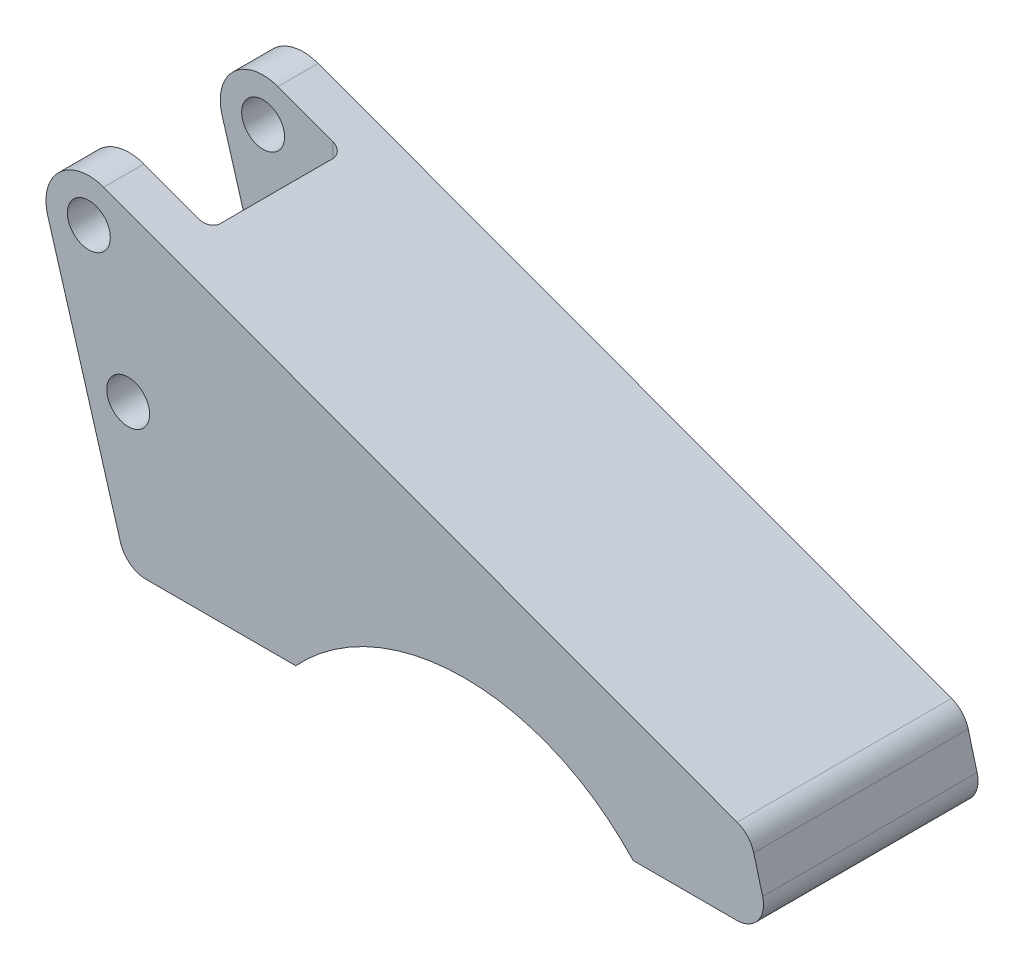
ISO-10303-21;
HEADER;
FILE_DESCRIPTION(('STEP AP214'),'2;1');
FILE_NAME('part.step','',(''),(''),'','','');
FILE_SCHEMA(('AUTOMOTIVE_DESIGN { 1 0 10303 214 1 1 1 1 }'));
ENDSEC;
DATA;
#1=APPLICATION_CONTEXT('core data for automotive mechanical design processes');
#2=APPLICATION_PROTOCOL_DEFINITION('international standard','automotive_design',2000,#1);
#3=PRODUCT_CONTEXT('',#1,'mechanical');
#4=PRODUCT('Part','Part','',(#3));
#5=PRODUCT_RELATED_PRODUCT_CATEGORY('part','',(#4));
#6=PRODUCT_DEFINITION_FORMATION('','',#4);
#7=PRODUCT_DEFINITION_CONTEXT('part definition',#1,'design');
#8=PRODUCT_DEFINITION('design','',#6,#7);
#9=PRODUCT_DEFINITION_SHAPE('','',#8);
#10=(LENGTH_UNIT() NAMED_UNIT(*) SI_UNIT(.MILLI.,.METRE.));
#11=(NAMED_UNIT(*) PLANE_ANGLE_UNIT() SI_UNIT($,.RADIAN.));
#12=(NAMED_UNIT(*) SI_UNIT($,.STERADIAN.) SOLID_ANGLE_UNIT());
#13=UNCERTAINTY_MEASURE_WITH_UNIT(LENGTH_MEASURE(1.E-05),#10,'distance_accuracy_value','');
#14=(GEOMETRIC_REPRESENTATION_CONTEXT(3) GLOBAL_UNCERTAINTY_ASSIGNED_CONTEXT((#13)) GLOBAL_UNIT_ASSIGNED_CONTEXT((#10,
#11,#12)) REPRESENTATION_CONTEXT('',''));
#15=CARTESIAN_POINT('',(0.,0.,0.));
#16=DIRECTION('',(0.,0.,1.));
#17=DIRECTION('',(1.,0.,0.));
#18=AXIS2_PLACEMENT_3D('',#15,#16,#17);
#19=CARTESIAN_POINT('',(6.94754617431199,-51.87,-40.));
#20=DIRECTION('',(-0.959205668272246,-0.282709189723987,0.));
#21=DIRECTION('',(0.282709189723987,-0.959205668272246,0.));
#22=AXIS2_PLACEMENT_3D('',#19,#20,#21);
#23=PLANE('',#22);
#24=DIRECTION('',(0.282709189723987,-0.959205668272246,0.));
#25=VECTOR('',#24,1.);
#26=CARTESIAN_POINT('',(6.94754617431199,-51.87,-32.5));
#27=LINE('',#26,#25);
#28=CARTESIAN_POINT('',(-7.67364534617797,-2.2616735177919,-32.5));
#29=VERTEX_POINT('',#28);
#30=CARTESIAN_POINT('',(5.8905012126467,-48.2835459486199,-32.5));
#31=VERTEX_POINT('',#30);
#32=EDGE_CURVE('E168',#29,#31,#27,.T.);
#33=ORIENTED_EDGE('',*,*,#32,.F.);
#34=DIRECTION('',(0.,0.,1.));
#35=VECTOR('',#34,1.);
#36=CARTESIAN_POINT('',(-7.67364534617797,-2.2616735177919,-40.));
#37=LINE('',#36,#35);
#38=CARTESIAN_POINT('',(-7.67364534617797,-2.2616735177919,-40.));
#39=VERTEX_POINT('',#38);
#40=EDGE_CURVE('E222',#39,#29,#37,.T.);
#41=ORIENTED_EDGE('',*,*,#40,.F.);
#42=DIRECTION('',(0.282709189723987,-0.959205668272246,0.));
#43=VECTOR('',#42,1.);
#44=CARTESIAN_POINT('',(6.94754617431199,-51.87,-40.));
#45=LINE('',#44,#43);
#46=CARTESIAN_POINT('',(5.8905012126467,-48.2835459486199,-40.));
#47=VERTEX_POINT('',#46);
#48=EDGE_CURVE('E237',#39,#47,#45,.T.);
#49=ORIENTED_EDGE('',*,*,#48,.T.);
#50=DIRECTION('',(0.,0.,1.));
#51=VECTOR('',#50,1.);
#52=CARTESIAN_POINT('',(5.8905012126467,-48.2835459486199,-40.));
#53=LINE('',#52,#51);
#54=EDGE_CURVE('E179',#47,#31,#53,.T.);
#55=ORIENTED_EDGE('',*,*,#54,.T.);
#56=EDGE_LOOP('',(#33,#41,#49,#55));
#57=FACE_BOUND('',#56,.T.);
#58=ADVANCED_FACE('F32',(#57),#23,.T.);
#59=CARTESIAN_POINT('',(0.,0.,-40.));
#60=DIRECTION('',(0.,0.,1.));
#61=DIRECTION('',(1.,0.,0.));
#62=AXIS2_PLACEMENT_3D('',#59,#60,#61);
#63=CYLINDRICAL_SURFACE('',#62,8.);
#64=CARTESIAN_POINT('',(0.,0.,-7.5));
#65=DIRECTION('',(0.,0.,1.));
#66=DIRECTION('',(1.,0.,0.));
#67=AXIS2_PLACEMENT_3D('',#64,#65,#66);
#68=CIRCLE('',#67,8.);
#69=CARTESIAN_POINT('',(-7.67364534617797,-2.2616735177919,-7.5));
#70=VERTEX_POINT('',#69);
#71=CARTESIAN_POINT('',(2.76335629071986,7.50758696323518,-7.5));
#72=VERTEX_POINT('',#71);
#73=EDGE_CURVE('E338',#70,#72,#68,.F.);
#74=ORIENTED_EDGE('',*,*,#73,.F.);
#75=CARTESIAN_POINT('',(-7.67364534617797,-2.2616735177919,0.));
#76=VERTEX_POINT('',#75);
#77=EDGE_CURVE('E226',#70,#76,#37,.T.);
#78=ORIENTED_EDGE('',*,*,#77,.T.);
#79=CARTESIAN_POINT('',(0.,0.,0.));
#80=DIRECTION('',(0.,0.,1.));
#81=DIRECTION('',(1.,0.,0.));
#82=AXIS2_PLACEMENT_3D('',#79,#80,#81);
#83=CIRCLE('',#82,8.);
#84=CARTESIAN_POINT('',(2.76335629071986,7.50758696323518,0.));
#85=VERTEX_POINT('',#84);
#86=EDGE_CURVE('E280',#85,#76,#83,.T.);
#87=ORIENTED_EDGE('',*,*,#86,.F.);
#88=DIRECTION('',(0.,0.,1.));
#89=VECTOR('',#88,1.);
#90=CARTESIAN_POINT('',(2.76335629071986,7.50758696323518,-40.));
#91=LINE('',#90,#89);
#92=EDGE_CURVE('E227',#72,#85,#91,.T.);
#93=ORIENTED_EDGE('',*,*,#92,.F.);
#94=EDGE_LOOP('',(#74,#78,#87,#93));
#95=FACE_BOUND('',#94,.T.);
#96=ADVANCED_FACE('F354',(#95),#63,.T.);
#97=CARTESIAN_POINT('',(0.,0.,-40.));
#98=DIRECTION('',(0.,0.,1.));
#99=DIRECTION('',(1.,0.,0.));
#100=AXIS2_PLACEMENT_3D('',#97,#98,#99);
#101=CYLINDRICAL_SURFACE('',#100,4.);
#102=CARTESIAN_POINT('',(0.,0.,-32.5));
#103=DIRECTION('',(0.,0.,-1.));
#104=DIRECTION('',(-1.,0.,0.));
#105=AXIS2_PLACEMENT_3D('',#102,#103,#104);
#106=CIRCLE('',#105,4.);
#107=CARTESIAN_POINT('',(-4.,0.,-32.5));
#108=VERTEX_POINT('',#107);
#109=EDGE_CURVE('E321',#108,#108,#106,.F.);
#110=ORIENTED_EDGE('',*,*,#109,.T.);
#111=EDGE_LOOP('',(#110));
#112=FACE_BOUND('',#111,.T.);
#113=CARTESIAN_POINT('',(0.,0.,-40.));
#114=DIRECTION('',(0.,0.,1.));
#115=DIRECTION('',(1.,0.,0.));
#116=AXIS2_PLACEMENT_3D('',#113,#114,#115);
#117=CIRCLE('',#116,4.);
#118=CARTESIAN_POINT('',(4.,0.,-40.));
#119=VERTEX_POINT('',#118);
#120=EDGE_CURVE('E298',#119,#119,#117,.T.);
#121=ORIENTED_EDGE('',*,*,#120,.F.);
#122=EDGE_LOOP('',(#121));
#123=FACE_BOUND('',#122,.T.);
#124=ADVANCED_FACE('F386',(#112,#123),#101,.F.);
#125=CARTESIAN_POINT('',(7.33,-24.87,-40.));
#126=DIRECTION('',(0.,0.,1.));
#127=DIRECTION('',(1.,0.,0.));
#128=AXIS2_PLACEMENT_3D('',#125,#126,#127);
#129=CYLINDRICAL_SURFACE('',#128,4.);
#130=CARTESIAN_POINT('',(7.33,-24.87,-32.5));
#131=DIRECTION('',(0.,0.,-1.));
#132=DIRECTION('',(-1.,0.,0.));
#133=AXIS2_PLACEMENT_3D('',#130,#131,#132);
#134=CIRCLE('',#133,4.);
#135=CARTESIAN_POINT('',(3.33,-24.87,-32.5));
#136=VERTEX_POINT('',#135);
#137=EDGE_CURVE('E213',#136,#136,#134,.F.);
#138=ORIENTED_EDGE('',*,*,#137,.T.);
#139=EDGE_LOOP('',(#138));
#140=FACE_BOUND('',#139,.T.);
#141=CARTESIAN_POINT('',(7.33,-24.87,-40.));
#142=DIRECTION('',(0.,0.,1.));
#143=DIRECTION('',(1.,0.,0.));
#144=AXIS2_PLACEMENT_3D('',#141,#142,#143);
#145=CIRCLE('',#144,4.);
#146=CARTESIAN_POINT('',(11.33,-24.87,-40.));
#147=VERTEX_POINT('',#146);
#148=EDGE_CURVE('E315',#147,#147,#145,.T.);
#149=ORIENTED_EDGE('',*,*,#148,.F.);
#150=EDGE_LOOP('',(#149));
#151=FACE_BOUND('',#150,.T.);
#152=ADVANCED_FACE('F398',(#140,#151),#129,.F.);
#153=CARTESIAN_POINT('',(10.6865295540079,-46.87,-40.));
#154=DIRECTION('',(0.,0.,1.));
#155=DIRECTION('',(1.,0.,0.));
#156=AXIS2_PLACEMENT_3D('',#153,#154,#155);
#157=CYLINDRICAL_SURFACE('',#156,5.);
#158=CARTESIAN_POINT('',(10.6865295540079,-46.87,-32.5));
#159=DIRECTION('',(0.,0.,-1.));
#160=DIRECTION('',(-1.,0.,0.));
#161=AXIS2_PLACEMENT_3D('',#158,#159,#160);
#162=CIRCLE('',#161,5.);
#163=CARTESIAN_POINT('',(10.6865295540079,-51.87,-32.5));
#164=VERTEX_POINT('',#163);
#165=EDGE_CURVE('E164',#31,#164,#162,.F.);
#166=ORIENTED_EDGE('',*,*,#165,.F.);
#167=ORIENTED_EDGE('',*,*,#54,.F.);
#168=CARTESIAN_POINT('',(10.6865295540079,-46.87,-40.));
#169=DIRECTION('',(0.,0.,1.));
#170=DIRECTION('',(1.,0.,0.));
#171=AXIS2_PLACEMENT_3D('',#168,#169,#170);
#172=CIRCLE('',#171,5.);
#173=CARTESIAN_POINT('',(10.6865295540079,-51.87,-40.));
#174=VERTEX_POINT('',#173);
#175=EDGE_CURVE('E177',#174,#47,#172,.F.);
#176=ORIENTED_EDGE('',*,*,#175,.F.);
#177=DIRECTION('',(0.,0.,1.));
#178=VECTOR('',#177,1.);
#179=CARTESIAN_POINT('',(10.6865295540079,-51.87,-40.));
#180=LINE('',#179,#178);
#181=EDGE_CURVE('E157',#164,#174,#180,.F.);
#182=ORIENTED_EDGE('',*,*,#181,.F.);
#183=EDGE_LOOP('',(#166,#167,#176,#182));
#184=FACE_BOUND('',#183,.T.);
#185=ADVANCED_FACE('F176',(#184),#157,.T.);
#186=CARTESIAN_POINT('',(38.5852070424871,-51.87,-40.));
#187=DIRECTION('',(0.,-1.,0.));
#188=DIRECTION('',(1.,0.,0.));
#189=AXIS2_PLACEMENT_3D('',#186,#187,#188);
#190=PLANE('',#189);
#191=DIRECTION('',(0.,0.,-1.));
#192=VECTOR('',#191,1.);
#193=CARTESIAN_POINT('',(15.,-51.87,-32.5));
#194=LINE('',#193,#192);
#195=CARTESIAN_POINT('',(15.,-51.87,-9.5));
#196=VERTEX_POINT('',#195);
#197=CARTESIAN_POINT('',(15.,-51.87,-30.5));
#198=VERTEX_POINT('',#197);
#199=EDGE_CURVE('E161',#196,#198,#194,.T.);
#200=ORIENTED_EDGE('',*,*,#199,.T.);
#201=CARTESIAN_POINT('',(13.,-51.87,-30.5));
#202=DIRECTION('',(0.,-1.,0.));
#203=DIRECTION('',(1.,0.,0.));
#204=AXIS2_PLACEMENT_3D('',#201,#202,#203);
#205=CIRCLE('',#204,2.);
#206=CARTESIAN_POINT('',(13.,-51.87,-32.5));
#207=VERTEX_POINT('',#206);
#208=EDGE_CURVE('E11',#198,#207,#205,.F.);
#209=ORIENTED_EDGE('',*,*,#208,.T.);
#210=DIRECTION('',(-1.,0.,0.));
#211=VECTOR('',#210,1.);
#212=CARTESIAN_POINT('',(-10.,-51.87,-32.5));
#213=LINE('',#212,#211);
#214=EDGE_CURVE('E153',#207,#164,#213,.T.);
#215=ORIENTED_EDGE('',*,*,#214,.T.);
#216=ORIENTED_EDGE('',*,*,#181,.T.);
#217=DIRECTION('',(1.,0.,0.));
#218=VECTOR('',#217,1.);
#219=CARTESIAN_POINT('',(38.5852070424871,-51.87,-40.));
#220=LINE('',#219,#218);
#221=CARTESIAN_POINT('',(38.5852070424871,-51.87,-40.));
#222=VERTEX_POINT('',#221);
#223=EDGE_CURVE('E281',#174,#222,#220,.T.);
#224=ORIENTED_EDGE('',*,*,#223,.T.);
#225=DIRECTION('',(0.,0.,1.));
#226=VECTOR('',#225,1.);
#227=CARTESIAN_POINT('',(38.5852070424871,-51.87,-40.));
#228=LINE('',#227,#226);
#229=CARTESIAN_POINT('',(38.5852070424871,-51.87,0.));
#230=VERTEX_POINT('',#229);
#231=EDGE_CURVE('E234',#222,#230,#228,.T.);
#232=ORIENTED_EDGE('',*,*,#231,.T.);
#233=DIRECTION('',(1.,0.,0.));
#234=VECTOR('',#233,1.);
#235=CARTESIAN_POINT('',(38.5852070424871,-51.87,0.));
#236=LINE('',#235,#234);
#237=CARTESIAN_POINT('',(10.6865295540079,-51.87,0.));
#238=VERTEX_POINT('',#237);
#239=EDGE_CURVE('E296',#238,#230,#236,.T.);
#240=ORIENTED_EDGE('',*,*,#239,.F.);
#241=CARTESIAN_POINT('',(10.6865295540079,-51.87,-7.5));
#242=VERTEX_POINT('',#241);
#243=EDGE_CURVE('E178',#238,#242,#180,.F.);
#244=ORIENTED_EDGE('',*,*,#243,.T.);
#245=DIRECTION('',(1.,0.,0.));
#246=VECTOR('',#245,1.);
#247=CARTESIAN_POINT('',(-10.,-51.87,-7.5));
#248=LINE('',#247,#246);
#249=CARTESIAN_POINT('',(13.,-51.87,-7.5));
#250=VERTEX_POINT('',#249);
#251=EDGE_CURVE('E342',#242,#250,#248,.T.);
#252=ORIENTED_EDGE('',*,*,#251,.T.);
#253=CARTESIAN_POINT('',(13.,-51.87,-9.5));
#254=DIRECTION('',(0.,-1.,0.));
#255=DIRECTION('',(1.,0.,0.));
#256=AXIS2_PLACEMENT_3D('',#253,#254,#255);
#257=CIRCLE('',#256,2.);
#258=EDGE_CURVE('E200',#250,#196,#257,.F.);
#259=ORIENTED_EDGE('',*,*,#258,.T.);
#260=EDGE_LOOP('',(#200,#209,#215,#216,#224,#232,#240,#244,#252,#259));
#261=FACE_BOUND('',#260,.T.);
#262=ADVANCED_FACE('F155',(#261),#190,.T.);
#263=DIRECTION('',(-0.282709189723987,0.959205668272246,0.));
#264=VECTOR('',#263,1.);
#265=CARTESIAN_POINT('',(6.94754617431199,-51.87,-7.5));
#266=LINE('',#265,#264);
#267=CARTESIAN_POINT('',(5.8905012126467,-48.2835459486199,-7.5));
#268=VERTEX_POINT('',#267);
#269=EDGE_CURVE('E160',#268,#70,#266,.T.);
#270=ORIENTED_EDGE('',*,*,#269,.F.);
#271=CARTESIAN_POINT('',(5.8905012126467,-48.2835459486199,0.));
#272=VERTEX_POINT('',#271);
#273=EDGE_CURVE('E182',#268,#272,#53,.T.);
#274=ORIENTED_EDGE('',*,*,#273,.T.);
#275=DIRECTION('',(0.282709189723987,-0.959205668272246,0.));
#276=VECTOR('',#275,1.);
#277=CARTESIAN_POINT('',(6.94754617431199,-51.87,0.));
#278=LINE('',#277,#276);
#279=EDGE_CURVE('E267',#76,#272,#278,.T.);
#280=ORIENTED_EDGE('',*,*,#279,.F.);
#281=ORIENTED_EDGE('',*,*,#77,.F.);
#282=EDGE_LOOP('',(#270,#274,#280,#281));
#283=FACE_BOUND('',#282,.T.);
#284=ADVANCED_FACE('F264',(#283),#23,.T.);
#285=ORIENTED_EDGE('',*,*,#40,.T.);
#286=CARTESIAN_POINT('',(0.,0.,-32.5));
#287=DIRECTION('',(0.,0.,-1.));
#288=DIRECTION('',(-1.,0.,0.));
#289=AXIS2_PLACEMENT_3D('',#286,#287,#288);
#290=CIRCLE('',#289,8.);
#291=CARTESIAN_POINT('',(2.76335629071986,7.50758696323518,-32.5));
#292=VERTEX_POINT('',#291);
#293=EDGE_CURVE('E212',#292,#29,#290,.F.);
#294=ORIENTED_EDGE('',*,*,#293,.F.);
#295=CARTESIAN_POINT('',(2.76335629071986,7.50758696323518,-40.));
#296=VERTEX_POINT('',#295);
#297=EDGE_CURVE('E220',#296,#292,#91,.T.);
#298=ORIENTED_EDGE('',*,*,#297,.F.);
#299=CARTESIAN_POINT('',(0.,0.,-40.));
#300=DIRECTION('',(0.,0.,1.));
#301=DIRECTION('',(1.,0.,0.));
#302=AXIS2_PLACEMENT_3D('',#299,#300,#301);
#303=CIRCLE('',#302,8.);
#304=EDGE_CURVE('E301',#296,#39,#303,.T.);
#305=ORIENTED_EDGE('',*,*,#304,.T.);
#306=EDGE_LOOP('',(#285,#294,#298,#305));
#307=FACE_BOUND('',#306,.T.);
#308=ADVANCED_FACE('F218',(#307),#63,.T.);
#309=CARTESIAN_POINT('',(123.33,-36.87,-40.));
#310=DIRECTION('',(0.345419536339983,0.938448370404398,0.));
#311=DIRECTION('',(-0.938448370404398,0.345419536339983,0.));
#312=AXIS2_PLACEMENT_3D('',#309,#310,#311);
#313=PLANE('',#312);
#314=DIRECTION('',(-0.938448370404398,0.345419536339983,0.));
#315=VECTOR('',#314,1.);
#316=CARTESIAN_POINT('',(123.33,-36.87,-32.5));
#317=LINE('',#316,#315);
#318=CARTESIAN_POINT('',(13.,3.73973266751784,-32.5));
#319=VERTEX_POINT('',#318);
#320=EDGE_CURVE('E206',#319,#292,#317,.T.);
#321=ORIENTED_EDGE('',*,*,#320,.F.);
#322=CARTESIAN_POINT('',(13.,3.73973266751784,-30.5));
#323=DIRECTION('',(0.345419536339983,0.938448370404398,0.));
#324=DIRECTION('',(0.938448370404398,-0.345419536339983,0.));
#325=AXIS2_PLACEMENT_3D('',#322,#323,#324);
#326=ELLIPSE('',#325,2.13117744467728,2.);
#327=CARTESIAN_POINT('',(15.,3.00358234271918,-30.5));
#328=VERTEX_POINT('',#327);
#329=EDGE_CURVE('E40',#319,#328,#326,.F.);
#330=ORIENTED_EDGE('',*,*,#329,.T.);
#331=DIRECTION('',(0.,0.,-1.));
#332=VECTOR('',#331,1.);
#333=CARTESIAN_POINT('',(15.,3.00358234271918,-40.));
#334=LINE('',#333,#332);
#335=CARTESIAN_POINT('',(15.,3.00358234271918,-9.5));
#336=VERTEX_POINT('',#335);
#337=EDGE_CURVE('E172',#336,#328,#334,.T.);
#338=ORIENTED_EDGE('',*,*,#337,.F.);
#339=CARTESIAN_POINT('',(13.,3.73973266751784,-9.5));
#340=DIRECTION('',(0.345419536339983,0.938448370404398,0.));
#341=DIRECTION('',(0.938448370404398,-0.345419536339983,0.));
#342=AXIS2_PLACEMENT_3D('',#339,#340,#341);
#343=ELLIPSE('',#342,2.13117744467728,2.);
#344=CARTESIAN_POINT('',(13.,3.73973266751784,-7.5));
#345=VERTEX_POINT('',#344);
#346=EDGE_CURVE('E198',#336,#345,#343,.F.);
#347=ORIENTED_EDGE('',*,*,#346,.T.);
#348=DIRECTION('',(0.938448370404398,-0.345419536339983,0.));
#349=VECTOR('',#348,1.);
#350=CARTESIAN_POINT('',(123.33,-36.87,-7.5));
#351=LINE('',#350,#349);
#352=EDGE_CURVE('E335',#72,#345,#351,.T.);
#353=ORIENTED_EDGE('',*,*,#352,.F.);
#354=ORIENTED_EDGE('',*,*,#92,.T.);
#355=DIRECTION('',(-0.938448370404398,0.345419536339983,0.));
#356=VECTOR('',#355,1.);
#357=CARTESIAN_POINT('',(123.33,-36.87,0.));
#358=LINE('',#357,#356);
#359=CARTESIAN_POINT('',(120.894593949471,-35.9735875224431,0.));
#360=VERTEX_POINT('',#359);
#361=EDGE_CURVE('E284',#360,#85,#358,.T.);
#362=ORIENTED_EDGE('',*,*,#361,.F.);
#363=DIRECTION('',(0.,0.,1.));
#364=VECTOR('',#363,1.);
#365=CARTESIAN_POINT('',(120.894593949471,-35.9735875224431,-40.));
#366=LINE('',#365,#364);
#367=CARTESIAN_POINT('',(120.894593949471,-35.9735875224431,-40.));
#368=VERTEX_POINT('',#367);
#369=EDGE_CURVE('E256',#360,#368,#366,.F.);
#370=ORIENTED_EDGE('',*,*,#369,.T.);
#371=DIRECTION('',(-0.938448370404398,0.345419536339983,0.));
#372=VECTOR('',#371,1.);
#373=CARTESIAN_POINT('',(123.33,-36.87,-40.));
#374=LINE('',#373,#372);
#375=EDGE_CURVE('E225',#368,#296,#374,.T.);
#376=ORIENTED_EDGE('',*,*,#375,.T.);
#377=ORIENTED_EDGE('',*,*,#297,.T.);
#378=EDGE_LOOP('',(#321,#330,#338,#347,#353,#354,#362,#370,#376,#377));
#379=FACE_BOUND('',#378,.T.);
#380=ADVANCED_FACE('F204',(#379),#313,.T.);
#381=CARTESIAN_POINT('',(127.33,-51.87,-40.));
#382=DIRECTION('',(0.966234939601247,0.257662650560332,0.));
#383=DIRECTION('',(-0.257662650560332,0.966234939601247,0.));
#384=AXIS2_PLACEMENT_3D('',#381,#382,#383);
#385=PLANE('',#384);
#386=DIRECTION('',(-0.257662650560332,0.966234939601246,0.));
#387=VECTOR('',#386,1.);
#388=CARTESIAN_POINT('',(127.33,-51.87,0.));
#389=LINE('',#388,#387);
#390=CARTESIAN_POINT('',(125.65311646592,-45.5816867471983,0.));
#391=VERTEX_POINT('',#390);
#392=CARTESIAN_POINT('',(123.998670965777,-39.3775161216634,0.));
#393=VERTEX_POINT('',#392);
#394=EDGE_CURVE('E288',#391,#393,#389,.T.);
#395=ORIENTED_EDGE('',*,*,#394,.F.);
#396=DIRECTION('',(0.,0.,1.));
#397=VECTOR('',#396,1.);
#398=CARTESIAN_POINT('',(125.65311646592,-45.5816867471983,-40.));
#399=LINE('',#398,#397);
#400=CARTESIAN_POINT('',(125.65311646592,-45.5816867471983,-40.));
#401=VERTEX_POINT('',#400);
#402=EDGE_CURVE('E250',#391,#401,#399,.F.);
#403=ORIENTED_EDGE('',*,*,#402,.T.);
#404=DIRECTION('',(-0.257662650560332,0.966234939601246,0.));
#405=VECTOR('',#404,1.);
#406=CARTESIAN_POINT('',(127.33,-51.87,-40.));
#407=LINE('',#406,#405);
#408=CARTESIAN_POINT('',(123.998670965777,-39.3775161216634,-40.));
#409=VERTEX_POINT('',#408);
#410=EDGE_CURVE('E304',#401,#409,#407,.T.);
#411=ORIENTED_EDGE('',*,*,#410,.T.);
#412=DIRECTION('',(0.,0.,1.));
#413=VECTOR('',#412,1.);
#414=CARTESIAN_POINT('',(123.998670965777,-39.3775161216634,-40.));
#415=LINE('',#414,#413);
#416=EDGE_CURVE('E247',#409,#393,#415,.T.);
#417=ORIENTED_EDGE('',*,*,#416,.T.);
#418=EDGE_LOOP('',(#395,#403,#411,#417));
#419=FACE_BOUND('',#418,.T.);
#420=ADVANCED_FACE('F361',(#419),#385,.T.);
#421=CARTESIAN_POINT('',(101.494792957513,-51.87,-40.));
#422=DIRECTION('',(0.,-1.,0.));
#423=DIRECTION('',(1.,0.,0.));
#424=AXIS2_PLACEMENT_3D('',#421,#422,#423);
#425=PLANE('',#424);
#426=DIRECTION('',(1.,0.,0.));
#427=VECTOR('',#426,1.);
#428=CARTESIAN_POINT('',(101.494792957513,-51.87,-40.));
#429=LINE('',#428,#427);
#430=CARTESIAN_POINT('',(101.494792957513,-51.87,-40.));
#431=VERTEX_POINT('',#430);
#432=CARTESIAN_POINT('',(120.821941767913,-51.87,-40.));
#433=VERTEX_POINT('',#432);
#434=EDGE_CURVE('E307',#431,#433,#429,.T.);
#435=ORIENTED_EDGE('',*,*,#434,.T.);
#436=DIRECTION('',(0.,0.,1.));
#437=VECTOR('',#436,1.);
#438=CARTESIAN_POINT('',(120.821941767913,-51.87,-40.));
#439=LINE('',#438,#437);
#440=CARTESIAN_POINT('',(120.821941767913,-51.87,0.));
#441=VERTEX_POINT('',#440);
#442=EDGE_CURVE('E238',#433,#441,#439,.T.);
#443=ORIENTED_EDGE('',*,*,#442,.T.);
#444=DIRECTION('',(1.,0.,0.));
#445=VECTOR('',#444,1.);
#446=CARTESIAN_POINT('',(101.494792957513,-51.87,0.));
#447=LINE('',#446,#445);
#448=CARTESIAN_POINT('',(101.494792957513,-51.87,0.));
#449=VERTEX_POINT('',#448);
#450=EDGE_CURVE('E291',#449,#441,#447,.T.);
#451=ORIENTED_EDGE('',*,*,#450,.F.);
#452=DIRECTION('',(0.,0.,1.));
#453=VECTOR('',#452,1.);
#454=CARTESIAN_POINT('',(101.494792957513,-51.87,-40.));
#455=LINE('',#454,#453);
#456=EDGE_CURVE('E230',#431,#449,#455,.T.);
#457=ORIENTED_EDGE('',*,*,#456,.F.);
#458=EDGE_LOOP('',(#435,#443,#451,#457));
#459=FACE_BOUND('',#458,.T.);
#460=ADVANCED_FACE('F373',(#459),#425,.T.);
#461=CARTESIAN_POINT('',(70.04,-80.88,-40.));
#462=DIRECTION('',(0.,0.,1.));
#463=DIRECTION('',(1.,0.,0.));
#464=AXIS2_PLACEMENT_3D('',#461,#462,#463);
#465=CYLINDRICAL_SURFACE('',#464,42.79);
#466=CARTESIAN_POINT('',(70.04,-80.88,0.));
#467=DIRECTION('',(0.,0.,-1.));
#468=DIRECTION('',(1.,0.,0.));
#469=AXIS2_PLACEMENT_3D('',#466,#467,#468);
#470=CIRCLE('',#469,42.79);
#471=EDGE_CURVE('E293',#230,#449,#470,.T.);
#472=ORIENTED_EDGE('',*,*,#471,.F.);
#473=ORIENTED_EDGE('',*,*,#231,.F.);
#474=CARTESIAN_POINT('',(70.04,-80.88,-40.));
#475=DIRECTION('',(0.,0.,-1.));
#476=DIRECTION('',(1.,0.,0.));
#477=AXIS2_PLACEMENT_3D('',#474,#475,#476);
#478=CIRCLE('',#477,42.79);
#479=EDGE_CURVE('E282',#222,#431,#478,.T.);
#480=ORIENTED_EDGE('',*,*,#479,.T.);
#481=ORIENTED_EDGE('',*,*,#456,.T.);
#482=EDGE_LOOP('',(#472,#473,#480,#481));
#483=FACE_BOUND('',#482,.T.);
#484=ADVANCED_FACE('F377',(#483),#465,.F.);
#485=CARTESIAN_POINT('',(0.,0.,-40.));
#486=DIRECTION('',(0.,0.,1.));
#487=DIRECTION('',(1.,0.,0.));
#488=AXIS2_PLACEMENT_3D('',#485,#486,#487);
#489=PLANE('',#488);
#490=ORIENTED_EDGE('',*,*,#148,.T.);
#491=EDGE_LOOP('',(#490));
#492=FACE_BOUND('',#491,.T.);
#493=ORIENTED_EDGE('',*,*,#120,.T.);
#494=EDGE_LOOP('',(#493));
#495=FACE_BOUND('',#494,.T.);
#496=ORIENTED_EDGE('',*,*,#410,.F.);
#497=CARTESIAN_POINT('',(120.821941767913,-46.87,-40.));
#498=DIRECTION('',(0.,0.,1.));
#499=DIRECTION('',(1.,0.,0.));
#500=AXIS2_PLACEMENT_3D('',#497,#498,#499);
#501=CIRCLE('',#500,5.);
#502=EDGE_CURVE('E255',#401,#433,#501,.F.);
#503=ORIENTED_EDGE('',*,*,#502,.T.);
#504=ORIENTED_EDGE('',*,*,#434,.F.);
#505=ORIENTED_EDGE('',*,*,#479,.F.);
#506=ORIENTED_EDGE('',*,*,#223,.F.);
#507=ORIENTED_EDGE('',*,*,#175,.T.);
#508=ORIENTED_EDGE('',*,*,#48,.F.);
#509=ORIENTED_EDGE('',*,*,#304,.F.);
#510=ORIENTED_EDGE('',*,*,#375,.F.);
#511=CARTESIAN_POINT('',(119.167496267771,-40.6658293744651,-40.));
#512=DIRECTION('',(0.,0.,1.));
#513=DIRECTION('',(1.,0.,0.));
#514=AXIS2_PLACEMENT_3D('',#511,#512,#513);
#515=CIRCLE('',#514,5.);
#516=EDGE_CURVE('E253',#368,#409,#515,.F.);
#517=ORIENTED_EDGE('',*,*,#516,.T.);
#518=EDGE_LOOP('',(#496,#503,#504,#505,#506,#507,#508,#509,#510,#517));
#519=FACE_BOUND('',#518,.T.);
#520=ADVANCED_FACE('F366',(#492,#495,#519),#489,.F.);
#521=CARTESIAN_POINT('',(0.,0.,0.));
#522=DIRECTION('',(0.,0.,1.));
#523=DIRECTION('',(1.,0.,0.));
#524=AXIS2_PLACEMENT_3D('',#521,#522,#523);
#525=PLANE('',#524);
#526=CARTESIAN_POINT('',(7.33,-24.87,0.));
#527=DIRECTION('',(0.,0.,1.));
#528=DIRECTION('',(1.,0.,0.));
#529=AXIS2_PLACEMENT_3D('',#526,#527,#528);
#530=CIRCLE('',#529,4.);
#531=CARTESIAN_POINT('',(11.33,-24.87,0.));
#532=VERTEX_POINT('',#531);
#533=EDGE_CURVE('E318',#532,#532,#530,.T.);
#534=ORIENTED_EDGE('',*,*,#533,.F.);
#535=EDGE_LOOP('',(#534));
#536=FACE_BOUND('',#535,.T.);
#537=CARTESIAN_POINT('',(0.,0.,0.));
#538=DIRECTION('',(0.,0.,1.));
#539=DIRECTION('',(1.,0.,0.));
#540=AXIS2_PLACEMENT_3D('',#537,#538,#539);
#541=CIRCLE('',#540,4.);
#542=CARTESIAN_POINT('',(4.,0.,0.));
#543=VERTEX_POINT('',#542);
#544=EDGE_CURVE('E312',#543,#543,#541,.T.);
#545=ORIENTED_EDGE('',*,*,#544,.F.);
#546=EDGE_LOOP('',(#545));
#547=FACE_BOUND('',#546,.T.);
#548=ORIENTED_EDGE('',*,*,#450,.T.);
#549=CARTESIAN_POINT('',(120.821941767913,-46.87,0.));
#550=DIRECTION('',(0.,0.,1.));
#551=DIRECTION('',(1.,0.,0.));
#552=AXIS2_PLACEMENT_3D('',#549,#550,#551);
#553=CIRCLE('',#552,5.);
#554=EDGE_CURVE('E245',#441,#391,#553,.T.);
#555=ORIENTED_EDGE('',*,*,#554,.T.);
#556=ORIENTED_EDGE('',*,*,#394,.T.);
#557=CARTESIAN_POINT('',(119.167496267771,-40.6658293744651,0.));
#558=DIRECTION('',(0.,0.,1.));
#559=DIRECTION('',(1.,0.,0.));
#560=AXIS2_PLACEMENT_3D('',#557,#558,#559);
#561=CIRCLE('',#560,5.);
#562=EDGE_CURVE('E243',#393,#360,#561,.T.);
#563=ORIENTED_EDGE('',*,*,#562,.T.);
#564=ORIENTED_EDGE('',*,*,#361,.T.);
#565=ORIENTED_EDGE('',*,*,#86,.T.);
#566=ORIENTED_EDGE('',*,*,#279,.T.);
#567=CARTESIAN_POINT('',(10.6865295540079,-46.87,0.));
#568=DIRECTION('',(0.,0.,1.));
#569=DIRECTION('',(1.,0.,0.));
#570=AXIS2_PLACEMENT_3D('',#567,#568,#569);
#571=CIRCLE('',#570,5.);
#572=EDGE_CURVE('E241',#272,#238,#571,.T.);
#573=ORIENTED_EDGE('',*,*,#572,.T.);
#574=ORIENTED_EDGE('',*,*,#239,.T.);
#575=ORIENTED_EDGE('',*,*,#471,.T.);
#576=EDGE_LOOP('',(#548,#555,#556,#563,#564,#565,#566,#573,#574,#575));
#577=FACE_BOUND('',#576,.T.);
#578=ADVANCED_FACE('F277',(#536,#547,#577),#525,.T.);
#579=CARTESIAN_POINT('',(0.,0.,-7.5));
#580=DIRECTION('',(0.,0.,1.));
#581=DIRECTION('',(1.,0.,0.));
#582=AXIS2_PLACEMENT_3D('',#579,#580,#581);
#583=CIRCLE('',#582,4.);
#584=CARTESIAN_POINT('',(4.,0.,-7.5));
#585=VERTEX_POINT('',#584);
#586=EDGE_CURVE('E329',#585,#585,#583,.F.);
#587=ORIENTED_EDGE('',*,*,#586,.T.);
#588=EDGE_LOOP('',(#587));
#589=FACE_BOUND('',#588,.T.);
#590=ORIENTED_EDGE('',*,*,#544,.T.);
#591=EDGE_LOOP('',(#590));
#592=FACE_BOUND('',#591,.T.);
#593=ADVANCED_FACE('F423',(#589,#592),#101,.F.);
#594=CARTESIAN_POINT('',(7.33,-24.87,-7.5));
#595=DIRECTION('',(0.,0.,1.));
#596=DIRECTION('',(1.,0.,0.));
#597=AXIS2_PLACEMENT_3D('',#594,#595,#596);
#598=CIRCLE('',#597,4.);
#599=CARTESIAN_POINT('',(11.33,-24.87,-7.5));
#600=VERTEX_POINT('',#599);
#601=EDGE_CURVE('E332',#600,#600,#598,.F.);
#602=ORIENTED_EDGE('',*,*,#601,.T.);
#603=EDGE_LOOP('',(#602));
#604=FACE_BOUND('',#603,.T.);
#605=ORIENTED_EDGE('',*,*,#533,.T.);
#606=EDGE_LOOP('',(#605));
#607=FACE_BOUND('',#606,.T.);
#608=ADVANCED_FACE('F405',(#604,#607),#129,.F.);
#609=CARTESIAN_POINT('',(120.821941767913,-46.87,-40.));
#610=DIRECTION('',(0.,0.,1.));
#611=DIRECTION('',(1.,0.,0.));
#612=AXIS2_PLACEMENT_3D('',#609,#610,#611);
#613=CYLINDRICAL_SURFACE('',#612,5.);
#614=ORIENTED_EDGE('',*,*,#502,.F.);
#615=ORIENTED_EDGE('',*,*,#402,.F.);
#616=ORIENTED_EDGE('',*,*,#554,.F.);
#617=ORIENTED_EDGE('',*,*,#442,.F.);
#618=EDGE_LOOP('',(#614,#615,#616,#617));
#619=FACE_BOUND('',#618,.T.);
#620=ADVANCED_FACE('F370',(#619),#613,.T.);
#621=CARTESIAN_POINT('',(119.167496267771,-40.6658293744651,-40.));
#622=DIRECTION('',(0.,0.,1.));
#623=DIRECTION('',(1.,0.,0.));
#624=AXIS2_PLACEMENT_3D('',#621,#622,#623);
#625=CYLINDRICAL_SURFACE('',#624,5.);
#626=ORIENTED_EDGE('',*,*,#516,.F.);
#627=ORIENTED_EDGE('',*,*,#369,.F.);
#628=ORIENTED_EDGE('',*,*,#562,.F.);
#629=ORIENTED_EDGE('',*,*,#416,.F.);
#630=EDGE_LOOP('',(#626,#627,#628,#629));
#631=FACE_BOUND('',#630,.T.);
#632=ADVANCED_FACE('F359',(#631),#625,.T.);
#633=CARTESIAN_POINT('',(10.6865295540079,-46.87,-7.5));
#634=DIRECTION('',(0.,0.,1.));
#635=DIRECTION('',(1.,0.,0.));
#636=AXIS2_PLACEMENT_3D('',#633,#634,#635);
#637=CIRCLE('',#636,5.);
#638=EDGE_CURVE('E173',#242,#268,#637,.F.);
#639=ORIENTED_EDGE('',*,*,#638,.F.);
#640=ORIENTED_EDGE('',*,*,#243,.F.);
#641=ORIENTED_EDGE('',*,*,#572,.F.);
#642=ORIENTED_EDGE('',*,*,#273,.F.);
#643=EDGE_LOOP('',(#639,#640,#641,#642));
#644=FACE_BOUND('',#643,.T.);
#645=ADVANCED_FACE('F272',(#644),#157,.T.);
#646=CARTESIAN_POINT('',(-10.,-51.87,-32.5));
#647=DIRECTION('',(0.,0.,-1.));
#648=DIRECTION('',(-1.,0.,0.));
#649=AXIS2_PLACEMENT_3D('',#646,#647,#648);
#650=PLANE('',#649);
#651=ORIENTED_EDGE('',*,*,#137,.F.);
#652=EDGE_LOOP('',(#651));
#653=FACE_BOUND('',#652,.T.);
#654=ORIENTED_EDGE('',*,*,#214,.F.);
#655=DIRECTION('',(0.,1.,0.));
#656=VECTOR('',#655,1.);
#657=CARTESIAN_POINT('',(13.,3.00358234271918,-32.5));
#658=LINE('',#657,#656);
#659=EDGE_CURVE('E196',#207,#319,#658,.T.);
#660=ORIENTED_EDGE('',*,*,#659,.T.);
#661=ORIENTED_EDGE('',*,*,#320,.T.);
#662=ORIENTED_EDGE('',*,*,#293,.T.);
#663=ORIENTED_EDGE('',*,*,#32,.T.);
#664=ORIENTED_EDGE('',*,*,#165,.T.);
#665=EDGE_LOOP('',(#654,#660,#661,#662,#663,#664));
#666=FACE_BOUND('',#665,.T.);
#667=ORIENTED_EDGE('',*,*,#109,.F.);
#668=EDGE_LOOP('',(#667));
#669=FACE_BOUND('',#668,.T.);
#670=ADVANCED_FACE('F165',(#653,#666,#669),#650,.F.);
#671=CARTESIAN_POINT('',(-10.,-51.87,-7.5));
#672=DIRECTION('',(0.,0.,1.));
#673=DIRECTION('',(1.,0.,0.));
#674=AXIS2_PLACEMENT_3D('',#671,#672,#673);
#675=PLANE('',#674);
#676=ORIENTED_EDGE('',*,*,#601,.F.);
#677=EDGE_LOOP('',(#676));
#678=FACE_BOUND('',#677,.T.);
#679=ORIENTED_EDGE('',*,*,#352,.T.);
#680=DIRECTION('',(0.,1.,0.));
#681=VECTOR('',#680,1.);
#682=CARTESIAN_POINT('',(13.,-51.87,-7.5));
#683=LINE('',#682,#681);
#684=EDGE_CURVE('E194',#345,#250,#683,.F.);
#685=ORIENTED_EDGE('',*,*,#684,.T.);
#686=ORIENTED_EDGE('',*,*,#251,.F.);
#687=ORIENTED_EDGE('',*,*,#638,.T.);
#688=ORIENTED_EDGE('',*,*,#269,.T.);
#689=ORIENTED_EDGE('',*,*,#73,.T.);
#690=EDGE_LOOP('',(#679,#685,#686,#687,#688,#689));
#691=FACE_BOUND('',#690,.T.);
#692=ORIENTED_EDGE('',*,*,#586,.F.);
#693=EDGE_LOOP('',(#692));
#694=FACE_BOUND('',#693,.T.);
#695=ADVANCED_FACE('F351',(#678,#691,#694),#675,.F.);
#696=CARTESIAN_POINT('',(15.,-51.87,-32.5));
#697=DIRECTION('',(1.,0.,0.));
#698=DIRECTION('',(0.,0.,-1.));
#699=AXIS2_PLACEMENT_3D('',#696,#697,#698);
#700=PLANE('',#699);
#701=ORIENTED_EDGE('',*,*,#199,.F.);
#702=DIRECTION('',(0.,1.,0.));
#703=VECTOR('',#702,1.);
#704=CARTESIAN_POINT('',(15.,3.00358234271918,-9.5));
#705=LINE('',#704,#703);
#706=EDGE_CURVE('E191',#196,#336,#705,.T.);
#707=ORIENTED_EDGE('',*,*,#706,.T.);
#708=ORIENTED_EDGE('',*,*,#337,.T.);
#709=DIRECTION('',(0.,1.,0.));
#710=VECTOR('',#709,1.);
#711=CARTESIAN_POINT('',(15.,-51.87,-30.5));
#712=LINE('',#711,#710);
#713=EDGE_CURVE('E189',#328,#198,#712,.F.);
#714=ORIENTED_EDGE('',*,*,#713,.T.);
#715=EDGE_LOOP('',(#701,#707,#708,#714));
#716=FACE_BOUND('',#715,.T.);
#717=ADVANCED_FACE('F209',(#716),#700,.F.);
#718=CARTESIAN_POINT('',(13.,-51.87,-9.5));
#719=DIRECTION('',(0.,-1.,0.));
#720=DIRECTION('',(0.,0.,-1.));
#721=AXIS2_PLACEMENT_3D('',#718,#719,#720);
#722=CYLINDRICAL_SURFACE('',#721,2.);
#723=ORIENTED_EDGE('',*,*,#258,.F.);
#724=ORIENTED_EDGE('',*,*,#684,.F.);
#725=ORIENTED_EDGE('',*,*,#346,.F.);
#726=ORIENTED_EDGE('',*,*,#706,.F.);
#727=EDGE_LOOP('',(#723,#724,#725,#726));
#728=FACE_BOUND('',#727,.T.);
#729=ADVANCED_FACE('F348',(#728),#722,.F.);
#730=CARTESIAN_POINT('',(13.,-51.87,-30.5));
#731=DIRECTION('',(0.,-1.,0.));
#732=DIRECTION('',(0.,0.,-1.));
#733=AXIS2_PLACEMENT_3D('',#730,#731,#732);
#734=CYLINDRICAL_SURFACE('',#733,2.);
#735=ORIENTED_EDGE('',*,*,#208,.F.);
#736=ORIENTED_EDGE('',*,*,#713,.F.);
#737=ORIENTED_EDGE('',*,*,#329,.F.);
#738=ORIENTED_EDGE('',*,*,#659,.F.);
#739=EDGE_LOOP('',(#735,#736,#737,#738));
#740=FACE_BOUND('',#739,.T.);
#741=ADVANCED_FACE('F34',(#740),#734,.F.);
#742=CLOSED_SHELL('',(#58,#96,#124,#152,#185,#262,#284,#308,#380,#420,#460,#484,#520,#578,#593,
#608,#620,#632,#645,#670,#695,#717,#729,#741));
#743=MANIFOLD_SOLID_BREP('B2',#742);
#744=ADVANCED_BREP_SHAPE_REPRESENTATION('',(#18,#743),#14);
#745=SHAPE_DEFINITION_REPRESENTATION(#9,#744);
ENDSEC;
END-ISO-10303-21;
